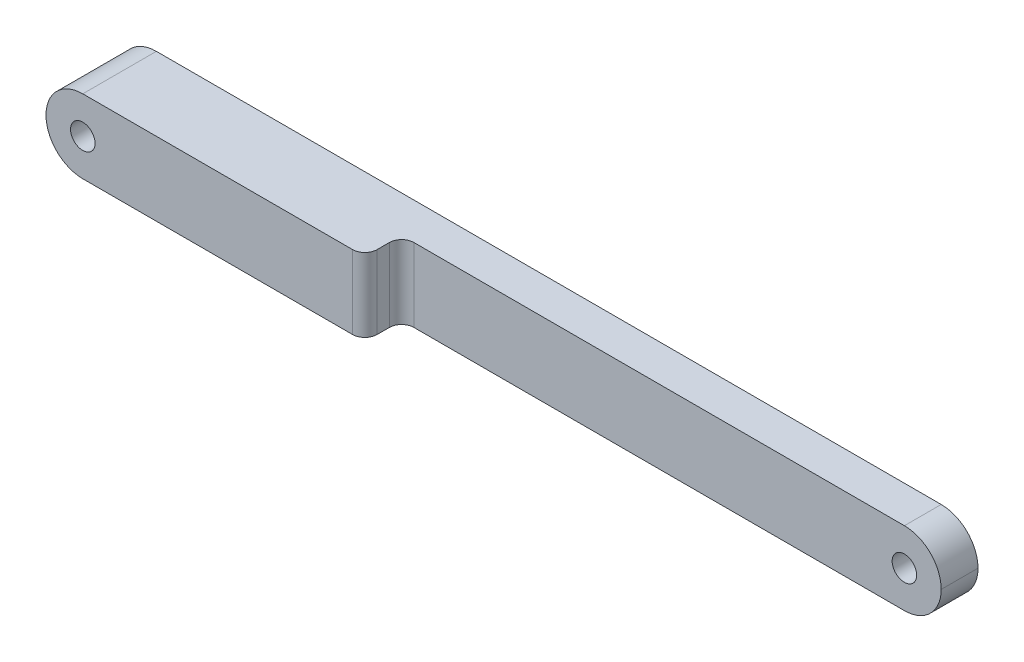
ISO-10303-21;
HEADER;
FILE_DESCRIPTION(('STEP AP214'),'2;1');
FILE_NAME('part.step','',(''),(''),'','','');
FILE_SCHEMA(('AUTOMOTIVE_DESIGN { 1 0 10303 214 1 1 1 1 }'));
ENDSEC;
DATA;
#1=APPLICATION_CONTEXT('core data for automotive mechanical design processes');
#2=APPLICATION_PROTOCOL_DEFINITION('international standard','automotive_design',2000,#1);
#3=PRODUCT_CONTEXT('',#1,'mechanical');
#4=PRODUCT('Part','Part','',(#3));
#5=PRODUCT_RELATED_PRODUCT_CATEGORY('part','',(#4));
#6=PRODUCT_DEFINITION_FORMATION('','',#4);
#7=PRODUCT_DEFINITION_CONTEXT('part definition',#1,'design');
#8=PRODUCT_DEFINITION('design','',#6,#7);
#9=PRODUCT_DEFINITION_SHAPE('','',#8);
#10=(LENGTH_UNIT() NAMED_UNIT(*) SI_UNIT(.MILLI.,.METRE.));
#11=(NAMED_UNIT(*) PLANE_ANGLE_UNIT() SI_UNIT($,.RADIAN.));
#12=(NAMED_UNIT(*) SI_UNIT($,.STERADIAN.) SOLID_ANGLE_UNIT());
#13=UNCERTAINTY_MEASURE_WITH_UNIT(LENGTH_MEASURE(1.E-05),#10,'distance_accuracy_value','');
#14=(GEOMETRIC_REPRESENTATION_CONTEXT(3) GLOBAL_UNCERTAINTY_ASSIGNED_CONTEXT((#13)) GLOBAL_UNIT_ASSIGNED_CONTEXT((#10,
#11,#12)) REPRESENTATION_CONTEXT('',''));
#15=CARTESIAN_POINT('',(0.,0.,0.));
#16=DIRECTION('',(0.,0.,1.));
#17=DIRECTION('',(1.,0.,0.));
#18=AXIS2_PLACEMENT_3D('',#15,#16,#17);
#19=CARTESIAN_POINT('',(335.,15.,-15.));
#20=DIRECTION('',(0.,0.,1.));
#21=DIRECTION('',(1.,0.,0.));
#22=AXIS2_PLACEMENT_3D('',#19,#20,#21);
#23=CYLINDRICAL_SURFACE('',#22,4.99999999999999);
#24=CARTESIAN_POINT('',(335.,15.,0.));
#25=DIRECTION('',(0.,0.,-1.));
#26=DIRECTION('',(-1.,0.,0.));
#27=AXIS2_PLACEMENT_3D('',#24,#25,#26);
#28=CIRCLE('',#27,4.99999999999999);
#29=CARTESIAN_POINT('',(330.,15.,0.));
#30=VERTEX_POINT('',#29);
#31=EDGE_CURVE('E199',#30,#30,#28,.T.);
#32=ORIENTED_EDGE('',*,*,#31,.F.);
#33=EDGE_LOOP('',(#32));
#34=FACE_BOUND('',#33,.T.);
#35=CARTESIAN_POINT('',(335.,15.,-15.));
#36=DIRECTION('',(0.,0.,1.));
#37=DIRECTION('',(1.,0.,0.));
#38=AXIS2_PLACEMENT_3D('',#35,#36,#37);
#39=CIRCLE('',#38,4.99999999999999);
#40=CARTESIAN_POINT('',(340.,15.,-15.));
#41=VERTEX_POINT('',#40);
#42=EDGE_CURVE('E169',#41,#41,#39,.T.);
#43=ORIENTED_EDGE('',*,*,#42,.F.);
#44=EDGE_LOOP('',(#43));
#45=FACE_BOUND('',#44,.T.);
#46=ADVANCED_FACE('F35',(#34,#45),#23,.F.);
#47=CARTESIAN_POINT('',(335.,15.,15.));
#48=DIRECTION('',(0.,0.,-1.));
#49=DIRECTION('',(-1.,0.,0.));
#50=AXIS2_PLACEMENT_3D('',#47,#48,#49);
#51=CYLINDRICAL_SURFACE('',#50,15.);
#52=CARTESIAN_POINT('',(335.,15.,0.));
#53=DIRECTION('',(0.,0.,-1.));
#54=DIRECTION('',(-1.,0.,0.));
#55=AXIS2_PLACEMENT_3D('',#52,#53,#54);
#56=CIRCLE('',#55,15.);
#57=CARTESIAN_POINT('',(335.,30.,0.));
#58=VERTEX_POINT('',#57);
#59=CARTESIAN_POINT('',(350.,15.,0.));
#60=VERTEX_POINT('',#59);
#61=EDGE_CURVE('E121',#58,#60,#56,.T.);
#62=ORIENTED_EDGE('',*,*,#61,.T.);
#63=DIRECTION('',(0.,0.,-1.));
#64=VECTOR('',#63,1.);
#65=CARTESIAN_POINT('',(350.,15.,15.));
#66=LINE('',#65,#64);
#67=CARTESIAN_POINT('',(350.,15.,-15.));
#68=VERTEX_POINT('',#67);
#69=EDGE_CURVE('E131',#68,#60,#66,.F.);
#70=ORIENTED_EDGE('',*,*,#69,.F.);
#71=CARTESIAN_POINT('',(335.,15.,-15.));
#72=DIRECTION('',(0.,0.,-1.));
#73=DIRECTION('',(-1.,0.,0.));
#74=AXIS2_PLACEMENT_3D('',#71,#72,#73);
#75=CIRCLE('',#74,15.);
#76=CARTESIAN_POINT('',(335.,30.,-15.));
#77=VERTEX_POINT('',#76);
#78=EDGE_CURVE('E141',#77,#68,#75,.T.);
#79=ORIENTED_EDGE('',*,*,#78,.F.);
#80=DIRECTION('',(0.,0.,-1.));
#81=VECTOR('',#80,1.);
#82=CARTESIAN_POINT('',(335.,30.,15.));
#83=LINE('',#82,#81);
#84=EDGE_CURVE('E160',#58,#77,#83,.T.);
#85=ORIENTED_EDGE('',*,*,#84,.F.);
#86=EDGE_LOOP('',(#62,#70,#79,#85));
#87=FACE_BOUND('',#86,.T.);
#88=ADVANCED_FACE('F229',(#87),#51,.T.);
#89=CARTESIAN_POINT('',(335.,15.,15.));
#90=DIRECTION('',(0.,0.,-1.));
#91=DIRECTION('',(-1.,0.,0.));
#92=AXIS2_PLACEMENT_3D('',#89,#90,#91);
#93=CYLINDRICAL_SURFACE('',#92,15.);
#94=CARTESIAN_POINT('',(335.,15.,0.));
#95=DIRECTION('',(0.,0.,-1.));
#96=DIRECTION('',(-1.,0.,0.));
#97=AXIS2_PLACEMENT_3D('',#94,#95,#96);
#98=CIRCLE('',#97,15.);
#99=CARTESIAN_POINT('',(335.,0.,0.));
#100=VERTEX_POINT('',#99);
#101=EDGE_CURVE('E116',#60,#100,#98,.T.);
#102=ORIENTED_EDGE('',*,*,#101,.T.);
#103=DIRECTION('',(0.,0.,-1.));
#104=VECTOR('',#103,1.);
#105=CARTESIAN_POINT('',(335.,0.,15.));
#106=LINE('',#105,#104);
#107=CARTESIAN_POINT('',(335.,0.,-15.));
#108=VERTEX_POINT('',#107);
#109=EDGE_CURVE('E129',#108,#100,#106,.F.);
#110=ORIENTED_EDGE('',*,*,#109,.F.);
#111=CARTESIAN_POINT('',(335.,15.,-15.));
#112=DIRECTION('',(0.,0.,-1.));
#113=DIRECTION('',(-1.,0.,0.));
#114=AXIS2_PLACEMENT_3D('',#111,#112,#113);
#115=CIRCLE('',#114,15.);
#116=EDGE_CURVE('E150',#68,#108,#115,.T.);
#117=ORIENTED_EDGE('',*,*,#116,.F.);
#118=ORIENTED_EDGE('',*,*,#69,.T.);
#119=EDGE_LOOP('',(#102,#110,#117,#118));
#120=FACE_BOUND('',#119,.T.);
#121=ADVANCED_FACE('F127',(#120),#93,.T.);
#122=CARTESIAN_POINT('',(350.,0.,15.));
#123=DIRECTION('',(0.,1.,0.));
#124=DIRECTION('',(-1.,0.,0.));
#125=AXIS2_PLACEMENT_3D('',#122,#123,#124);
#126=PLANE('',#125);
#127=ORIENTED_EDGE('',*,*,#109,.T.);
#128=DIRECTION('',(1.,0.,0.));
#129=VECTOR('',#128,1.);
#130=CARTESIAN_POINT('',(375.,0.,0.));
#131=LINE('',#130,#129);
#132=CARTESIAN_POINT('',(135.,0.,0.));
#133=VERTEX_POINT('',#132);
#134=EDGE_CURVE('E111',#133,#100,#131,.T.);
#135=ORIENTED_EDGE('',*,*,#134,.F.);
#136=CARTESIAN_POINT('',(135.,0.,4.99999999999997));
#137=DIRECTION('',(0.,1.,0.));
#138=DIRECTION('',(-1.,0.,0.));
#139=AXIS2_PLACEMENT_3D('',#136,#137,#138);
#140=CIRCLE('',#139,5.);
#141=CARTESIAN_POINT('',(130.,0.,4.99999999999997));
#142=VERTEX_POINT('',#141);
#143=EDGE_CURVE('E43',#133,#142,#140,.T.);
#144=ORIENTED_EDGE('',*,*,#143,.T.);
#145=DIRECTION('',(0.,0.,-1.));
#146=VECTOR('',#145,1.);
#147=CARTESIAN_POINT('',(130.,0.,15.000012));
#148=LINE('',#147,#146);
#149=CARTESIAN_POINT('',(130.,0.,10.));
#150=VERTEX_POINT('',#149);
#151=EDGE_CURVE('E171',#150,#142,#148,.T.);
#152=ORIENTED_EDGE('',*,*,#151,.F.);
#153=CARTESIAN_POINT('',(125.,0.,10.));
#154=DIRECTION('',(0.,1.,0.));
#155=DIRECTION('',(-1.,0.,0.));
#156=AXIS2_PLACEMENT_3D('',#153,#154,#155);
#157=CIRCLE('',#156,5.);
#158=CARTESIAN_POINT('',(125.,0.,15.));
#159=VERTEX_POINT('',#158);
#160=EDGE_CURVE('E178',#150,#159,#157,.F.);
#161=ORIENTED_EDGE('',*,*,#160,.T.);
#162=DIRECTION('',(1.,0.,0.));
#163=VECTOR('',#162,1.);
#164=CARTESIAN_POINT('',(350.,0.,15.));
#165=LINE('',#164,#163);
#166=CARTESIAN_POINT('',(15.,0.,15.));
#167=VERTEX_POINT('',#166);
#168=EDGE_CURVE('E143',#167,#159,#165,.T.);
#169=ORIENTED_EDGE('',*,*,#168,.F.);
#170=DIRECTION('',(0.,0.,-1.));
#171=VECTOR('',#170,1.);
#172=CARTESIAN_POINT('',(15.,0.,15.));
#173=LINE('',#172,#171);
#174=CARTESIAN_POINT('',(15.,0.,-15.));
#175=VERTEX_POINT('',#174);
#176=EDGE_CURVE('E138',#167,#175,#173,.T.);
#177=ORIENTED_EDGE('',*,*,#176,.T.);
#178=DIRECTION('',(1.,0.,0.));
#179=VECTOR('',#178,1.);
#180=CARTESIAN_POINT('',(350.,0.,-15.));
#181=LINE('',#180,#179);
#182=EDGE_CURVE('E137',#175,#108,#181,.T.);
#183=ORIENTED_EDGE('',*,*,#182,.T.);
#184=EDGE_LOOP('',(#127,#135,#144,#152,#161,#169,#177,#183));
#185=FACE_BOUND('',#184,.T.);
#186=ADVANCED_FACE('F134',(#185),#126,.F.);
#187=CARTESIAN_POINT('',(0.,30.,15.));
#188=DIRECTION('',(0.,-1.,0.));
#189=DIRECTION('',(0.,0.,-1.));
#190=AXIS2_PLACEMENT_3D('',#187,#188,#189);
#191=PLANE('',#190);
#192=DIRECTION('',(0.,0.,-1.));
#193=VECTOR('',#192,1.);
#194=CARTESIAN_POINT('',(130.,30.,15.000012));
#195=LINE('',#194,#193);
#196=CARTESIAN_POINT('',(130.,30.,10.));
#197=VERTEX_POINT('',#196);
#198=CARTESIAN_POINT('',(130.,30.,4.99999999999997));
#199=VERTEX_POINT('',#198);
#200=EDGE_CURVE('E196',#197,#199,#195,.T.);
#201=ORIENTED_EDGE('',*,*,#200,.T.);
#202=CARTESIAN_POINT('',(135.,30.,4.99999999999997));
#203=DIRECTION('',(0.,-1.,0.));
#204=DIRECTION('',(0.,0.,-1.));
#205=AXIS2_PLACEMENT_3D('',#202,#203,#204);
#206=CIRCLE('',#205,5.);
#207=CARTESIAN_POINT('',(135.,30.,0.));
#208=VERTEX_POINT('',#207);
#209=EDGE_CURVE('E11',#199,#208,#206,.T.);
#210=ORIENTED_EDGE('',*,*,#209,.T.);
#211=DIRECTION('',(-1.,0.,0.));
#212=VECTOR('',#211,1.);
#213=CARTESIAN_POINT('',(375.,30.,0.));
#214=LINE('',#213,#212);
#215=EDGE_CURVE('E122',#58,#208,#214,.T.);
#216=ORIENTED_EDGE('',*,*,#215,.F.);
#217=ORIENTED_EDGE('',*,*,#84,.T.);
#218=DIRECTION('',(-1.,0.,0.));
#219=VECTOR('',#218,1.);
#220=CARTESIAN_POINT('',(0.,30.,-15.));
#221=LINE('',#220,#219);
#222=CARTESIAN_POINT('',(15.,30.,-15.));
#223=VERTEX_POINT('',#222);
#224=EDGE_CURVE('E146',#77,#223,#221,.T.);
#225=ORIENTED_EDGE('',*,*,#224,.T.);
#226=DIRECTION('',(0.,0.,-1.));
#227=VECTOR('',#226,1.);
#228=CARTESIAN_POINT('',(15.,30.,15.));
#229=LINE('',#228,#227);
#230=CARTESIAN_POINT('',(15.,30.,15.));
#231=VERTEX_POINT('',#230);
#232=EDGE_CURVE('E162',#223,#231,#229,.F.);
#233=ORIENTED_EDGE('',*,*,#232,.T.);
#234=DIRECTION('',(-1.,0.,0.));
#235=VECTOR('',#234,1.);
#236=CARTESIAN_POINT('',(0.,30.,15.));
#237=LINE('',#236,#235);
#238=CARTESIAN_POINT('',(125.,30.,15.));
#239=VERTEX_POINT('',#238);
#240=EDGE_CURVE('E139',#239,#231,#237,.T.);
#241=ORIENTED_EDGE('',*,*,#240,.F.);
#242=CARTESIAN_POINT('',(125.,30.,10.));
#243=DIRECTION('',(0.,-1.,0.));
#244=DIRECTION('',(0.,0.,-1.));
#245=AXIS2_PLACEMENT_3D('',#242,#243,#244);
#246=CIRCLE('',#245,5.);
#247=EDGE_CURVE('E174',#239,#197,#246,.F.);
#248=ORIENTED_EDGE('',*,*,#247,.T.);
#249=EDGE_LOOP('',(#201,#210,#216,#217,#225,#233,#241,#248));
#250=FACE_BOUND('',#249,.T.);
#251=ADVANCED_FACE('F195',(#250),#191,.F.);
#252=CARTESIAN_POINT('',(0.,0.,15.));
#253=DIRECTION('',(0.,0.,-1.));
#254=DIRECTION('',(-1.,0.,0.));
#255=AXIS2_PLACEMENT_3D('',#252,#253,#254);
#256=PLANE('',#255);
#257=CARTESIAN_POINT('',(15.,15.,15.));
#258=DIRECTION('',(0.,0.,-1.));
#259=DIRECTION('',(-1.,0.,0.));
#260=AXIS2_PLACEMENT_3D('',#257,#258,#259);
#261=CIRCLE('',#260,5.);
#262=CARTESIAN_POINT('',(10.,15.,15.));
#263=VERTEX_POINT('',#262);
#264=EDGE_CURVE('E209',#263,#263,#261,.T.);
#265=ORIENTED_EDGE('',*,*,#264,.T.);
#266=EDGE_LOOP('',(#265));
#267=FACE_BOUND('',#266,.T.);
#268=ORIENTED_EDGE('',*,*,#168,.T.);
#269=DIRECTION('',(0.,1.,0.));
#270=VECTOR('',#269,1.);
#271=CARTESIAN_POINT('',(125.,0.,15.));
#272=LINE('',#271,#270);
#273=EDGE_CURVE('E165',#159,#239,#272,.T.);
#274=ORIENTED_EDGE('',*,*,#273,.T.);
#275=ORIENTED_EDGE('',*,*,#240,.T.);
#276=CARTESIAN_POINT('',(15.,15.,15.));
#277=DIRECTION('',(0.,0.,-1.));
#278=DIRECTION('',(-1.,0.,0.));
#279=AXIS2_PLACEMENT_3D('',#276,#277,#278);
#280=CIRCLE('',#279,15.);
#281=CARTESIAN_POINT('',(0.,15.,15.));
#282=VERTEX_POINT('',#281);
#283=EDGE_CURVE('E156',#231,#282,#280,.F.);
#284=ORIENTED_EDGE('',*,*,#283,.T.);
#285=CARTESIAN_POINT('',(15.,15.,15.));
#286=DIRECTION('',(0.,0.,-1.));
#287=DIRECTION('',(-1.,0.,0.));
#288=AXIS2_PLACEMENT_3D('',#285,#286,#287);
#289=CIRCLE('',#288,15.);
#290=EDGE_CURVE('E158',#282,#167,#289,.F.);
#291=ORIENTED_EDGE('',*,*,#290,.T.);
#292=EDGE_LOOP('',(#268,#274,#275,#284,#291));
#293=FACE_BOUND('',#292,.T.);
#294=ADVANCED_FACE('F189',(#267,#293),#256,.F.);
#295=CARTESIAN_POINT('',(0.,0.,-15.));
#296=DIRECTION('',(0.,0.,-1.));
#297=DIRECTION('',(-1.,0.,0.));
#298=AXIS2_PLACEMENT_3D('',#295,#296,#297);
#299=PLANE('',#298);
#300=CARTESIAN_POINT('',(15.,15.,-15.));
#301=DIRECTION('',(0.,0.,1.));
#302=DIRECTION('',(1.,0.,0.));
#303=AXIS2_PLACEMENT_3D('',#300,#301,#302);
#304=CIRCLE('',#303,5.);
#305=CARTESIAN_POINT('',(20.,15.,-15.));
#306=VERTEX_POINT('',#305);
#307=EDGE_CURVE('E206',#306,#306,#304,.T.);
#308=ORIENTED_EDGE('',*,*,#307,.T.);
#309=EDGE_LOOP('',(#308));
#310=FACE_BOUND('',#309,.T.);
#311=ORIENTED_EDGE('',*,*,#42,.T.);
#312=EDGE_LOOP('',(#311));
#313=FACE_BOUND('',#312,.T.);
#314=ORIENTED_EDGE('',*,*,#182,.F.);
#315=CARTESIAN_POINT('',(15.,15.,-15.));
#316=DIRECTION('',(0.,0.,-1.));
#317=DIRECTION('',(-1.,0.,0.));
#318=AXIS2_PLACEMENT_3D('',#315,#316,#317);
#319=CIRCLE('',#318,15.);
#320=CARTESIAN_POINT('',(0.,15.,-15.));
#321=VERTEX_POINT('',#320);
#322=EDGE_CURVE('E154',#175,#321,#319,.T.);
#323=ORIENTED_EDGE('',*,*,#322,.T.);
#324=CARTESIAN_POINT('',(15.,15.,-15.));
#325=DIRECTION('',(0.,0.,-1.));
#326=DIRECTION('',(-1.,0.,0.));
#327=AXIS2_PLACEMENT_3D('',#324,#325,#326);
#328=CIRCLE('',#327,15.);
#329=EDGE_CURVE('E152',#321,#223,#328,.T.);
#330=ORIENTED_EDGE('',*,*,#329,.T.);
#331=ORIENTED_EDGE('',*,*,#224,.F.);
#332=ORIENTED_EDGE('',*,*,#78,.T.);
#333=ORIENTED_EDGE('',*,*,#116,.T.);
#334=EDGE_LOOP('',(#314,#323,#330,#331,#332,#333));
#335=FACE_BOUND('',#334,.T.);
#336=ADVANCED_FACE('F227',(#310,#313,#335),#299,.T.);
#337=CARTESIAN_POINT('',(15.,15.,-15.));
#338=DIRECTION('',(0.,0.,1.));
#339=DIRECTION('',(1.,0.,0.));
#340=AXIS2_PLACEMENT_3D('',#337,#338,#339);
#341=CYLINDRICAL_SURFACE('',#340,5.);
#342=ORIENTED_EDGE('',*,*,#307,.F.);
#343=EDGE_LOOP('',(#342));
#344=FACE_BOUND('',#343,.T.);
#345=ORIENTED_EDGE('',*,*,#264,.F.);
#346=EDGE_LOOP('',(#345));
#347=FACE_BOUND('',#346,.T.);
#348=ADVANCED_FACE('F248',(#344,#347),#341,.F.);
#349=CARTESIAN_POINT('',(15.,15.,15.));
#350=DIRECTION('',(0.,0.,-1.));
#351=DIRECTION('',(-1.,0.,0.));
#352=AXIS2_PLACEMENT_3D('',#349,#350,#351);
#353=CYLINDRICAL_SURFACE('',#352,15.);
#354=DIRECTION('',(0.,0.,-1.));
#355=VECTOR('',#354,1.);
#356=CARTESIAN_POINT('',(0.,15.,15.));
#357=LINE('',#356,#355);
#358=EDGE_CURVE('E166',#282,#321,#357,.T.);
#359=ORIENTED_EDGE('',*,*,#358,.F.);
#360=ORIENTED_EDGE('',*,*,#283,.F.);
#361=ORIENTED_EDGE('',*,*,#232,.F.);
#362=ORIENTED_EDGE('',*,*,#329,.F.);
#363=EDGE_LOOP('',(#359,#360,#361,#362));
#364=FACE_BOUND('',#363,.T.);
#365=ADVANCED_FACE('F224',(#364),#353,.T.);
#366=CARTESIAN_POINT('',(15.,15.,15.));
#367=DIRECTION('',(0.,0.,-1.));
#368=DIRECTION('',(-1.,0.,0.));
#369=AXIS2_PLACEMENT_3D('',#366,#367,#368);
#370=CYLINDRICAL_SURFACE('',#369,15.);
#371=ORIENTED_EDGE('',*,*,#290,.F.);
#372=ORIENTED_EDGE('',*,*,#358,.T.);
#373=ORIENTED_EDGE('',*,*,#322,.F.);
#374=ORIENTED_EDGE('',*,*,#176,.F.);
#375=EDGE_LOOP('',(#371,#372,#373,#374));
#376=FACE_BOUND('',#375,.T.);
#377=ADVANCED_FACE('F226',(#376),#370,.T.);
#378=CARTESIAN_POINT('',(130.,0.,15.000012));
#379=DIRECTION('',(-1.,0.,0.));
#380=DIRECTION('',(0.,0.,1.));
#381=AXIS2_PLACEMENT_3D('',#378,#379,#380);
#382=PLANE('',#381);
#383=ORIENTED_EDGE('',*,*,#151,.T.);
#384=DIRECTION('',(0.,-1.,0.));
#385=VECTOR('',#384,1.);
#386=CARTESIAN_POINT('',(130.,30.,4.99999999999997));
#387=LINE('',#386,#385);
#388=EDGE_CURVE('E56',#142,#199,#387,.F.);
#389=ORIENTED_EDGE('',*,*,#388,.T.);
#390=ORIENTED_EDGE('',*,*,#200,.F.);
#391=DIRECTION('',(0.,1.,0.));
#392=VECTOR('',#391,1.);
#393=CARTESIAN_POINT('',(130.,0.,10.));
#394=LINE('',#393,#392);
#395=EDGE_CURVE('E176',#197,#150,#394,.F.);
#396=ORIENTED_EDGE('',*,*,#395,.T.);
#397=EDGE_LOOP('',(#383,#389,#390,#396));
#398=FACE_BOUND('',#397,.T.);
#399=ADVANCED_FACE('F198',(#398),#382,.F.);
#400=CARTESIAN_POINT('',(125.,0.,10.));
#401=DIRECTION('',(0.,1.,0.));
#402=DIRECTION('',(0.,0.,1.));
#403=AXIS2_PLACEMENT_3D('',#400,#401,#402);
#404=CYLINDRICAL_SURFACE('',#403,5.);
#405=ORIENTED_EDGE('',*,*,#160,.F.);
#406=ORIENTED_EDGE('',*,*,#395,.F.);
#407=ORIENTED_EDGE('',*,*,#247,.F.);
#408=ORIENTED_EDGE('',*,*,#273,.F.);
#409=EDGE_LOOP('',(#405,#406,#407,#408));
#410=FACE_BOUND('',#409,.T.);
#411=ADVANCED_FACE('F193',(#410),#404,.T.);
#412=CARTESIAN_POINT('',(375.,30.001,0.));
#413=DIRECTION('',(0.,0.,-1.));
#414=DIRECTION('',(-1.,0.,0.));
#415=AXIS2_PLACEMENT_3D('',#412,#413,#414);
#416=PLANE('',#415);
#417=ORIENTED_EDGE('',*,*,#215,.T.);
#418=DIRECTION('',(0.,-1.,0.));
#419=VECTOR('',#418,1.);
#420=CARTESIAN_POINT('',(135.,0.,0.));
#421=LINE('',#420,#419);
#422=EDGE_CURVE('E119',#208,#133,#421,.T.);
#423=ORIENTED_EDGE('',*,*,#422,.T.);
#424=ORIENTED_EDGE('',*,*,#134,.T.);
#425=ORIENTED_EDGE('',*,*,#101,.F.);
#426=ORIENTED_EDGE('',*,*,#61,.F.);
#427=EDGE_LOOP('',(#417,#423,#424,#425,#426));
#428=FACE_BOUND('',#427,.T.);
#429=ORIENTED_EDGE('',*,*,#31,.T.);
#430=EDGE_LOOP('',(#429));
#431=FACE_BOUND('',#430,.T.);
#432=ADVANCED_FACE('F114',(#428,#431),#416,.F.);
#433=CARTESIAN_POINT('',(135.,30.001,4.99999999999997));
#434=DIRECTION('',(0.,1.,0.));
#435=DIRECTION('',(0.,0.,1.));
#436=AXIS2_PLACEMENT_3D('',#433,#434,#435);
#437=CYLINDRICAL_SURFACE('',#436,5.);
#438=ORIENTED_EDGE('',*,*,#209,.F.);
#439=ORIENTED_EDGE('',*,*,#388,.F.);
#440=ORIENTED_EDGE('',*,*,#143,.F.);
#441=ORIENTED_EDGE('',*,*,#422,.F.);
#442=EDGE_LOOP('',(#438,#439,#440,#441));
#443=FACE_BOUND('',#442,.T.);
#444=ADVANCED_FACE('F37',(#443),#437,.F.);
#445=CLOSED_SHELL('',(#46,#88,#121,#186,#251,#294,#336,#348,#365,#377,#399,#411,#432,#444));
#446=MANIFOLD_SOLID_BREP('B2',#445);
#447=ADVANCED_BREP_SHAPE_REPRESENTATION('',(#18,#446),#14);
#448=SHAPE_DEFINITION_REPRESENTATION(#9,#447);
ENDSEC;
END-ISO-10303-21;
